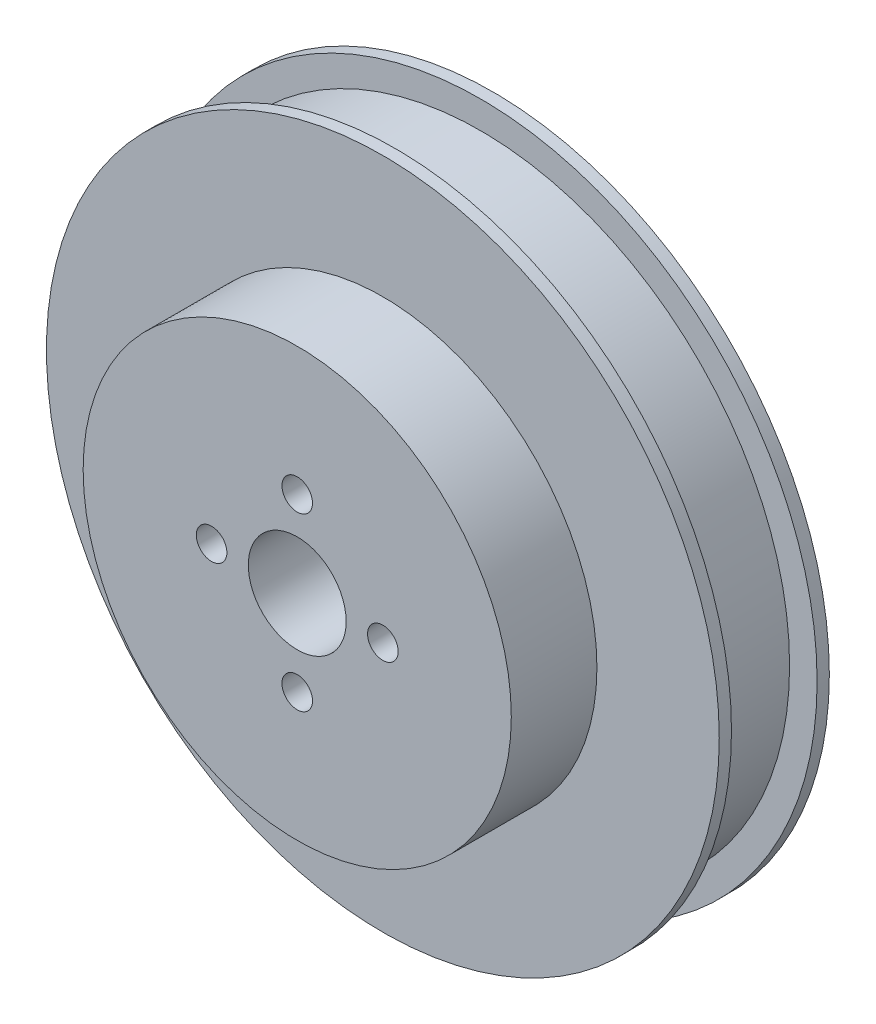
ISO-10303-21;
HEADER;
FILE_DESCRIPTION(('STEP AP214'),'2;1');
FILE_NAME('part.step','',(''),(''),'','','');
FILE_SCHEMA(('AUTOMOTIVE_DESIGN { 1 0 10303 214 1 1 1 1 }'));
ENDSEC;
DATA;
#1=APPLICATION_CONTEXT('core data for automotive mechanical design processes');
#2=APPLICATION_PROTOCOL_DEFINITION('international standard','automotive_design',2000,#1);
#3=PRODUCT_CONTEXT('',#1,'mechanical');
#4=PRODUCT('Part','Part','',(#3));
#5=PRODUCT_RELATED_PRODUCT_CATEGORY('part','',(#4));
#6=PRODUCT_DEFINITION_FORMATION('','',#4);
#7=PRODUCT_DEFINITION_CONTEXT('part definition',#1,'design');
#8=PRODUCT_DEFINITION('design','',#6,#7);
#9=PRODUCT_DEFINITION_SHAPE('','',#8);
#10=(LENGTH_UNIT() NAMED_UNIT(*) SI_UNIT(.MILLI.,.METRE.));
#11=(NAMED_UNIT(*) PLANE_ANGLE_UNIT() SI_UNIT($,.RADIAN.));
#12=(NAMED_UNIT(*) SI_UNIT($,.STERADIAN.) SOLID_ANGLE_UNIT());
#13=UNCERTAINTY_MEASURE_WITH_UNIT(LENGTH_MEASURE(1.E-05),#10,'distance_accuracy_value','');
#14=(GEOMETRIC_REPRESENTATION_CONTEXT(3) GLOBAL_UNCERTAINTY_ASSIGNED_CONTEXT((#13)) GLOBAL_UNIT_ASSIGNED_CONTEXT((#10,
#11,#12)) REPRESENTATION_CONTEXT('',''));
#15=CARTESIAN_POINT('',(0.,0.,0.));
#16=DIRECTION('',(0.,0.,1.));
#17=DIRECTION('',(1.,0.,0.));
#18=AXIS2_PLACEMENT_3D('',#15,#16,#17);
#19=CARTESIAN_POINT('',(0.,0.,1.));
#20=DIRECTION('',(0.,0.,-1.));
#21=DIRECTION('',(-1.,0.,0.));
#22=AXIS2_PLACEMENT_3D('',#19,#20,#21);
#23=CYLINDRICAL_SURFACE('',#22,27.5);
#24=CARTESIAN_POINT('',(0.,0.,1.));
#25=DIRECTION('',(0.,0.,1.));
#26=DIRECTION('',(1.,0.,0.));
#27=AXIS2_PLACEMENT_3D('',#24,#25,#26);
#28=CIRCLE('',#27,27.5);
#29=CARTESIAN_POINT('',(27.5,0.,1.));
#30=VERTEX_POINT('',#29);
#31=EDGE_CURVE('E43',#30,#30,#28,.T.);
#32=ORIENTED_EDGE('',*,*,#31,.F.);
#33=EDGE_LOOP('',(#32));
#34=FACE_BOUND('',#33,.T.);
#35=CARTESIAN_POINT('',(0.,0.,0.));
#36=DIRECTION('',(0.,0.,1.));
#37=DIRECTION('',(1.,0.,0.));
#38=AXIS2_PLACEMENT_3D('',#35,#36,#37);
#39=CIRCLE('',#38,27.5);
#40=CARTESIAN_POINT('',(27.5,0.,0.));
#41=VERTEX_POINT('',#40);
#42=EDGE_CURVE('E57',#41,#41,#39,.T.);
#43=ORIENTED_EDGE('',*,*,#42,.T.);
#44=EDGE_LOOP('',(#43));
#45=FACE_BOUND('',#44,.T.);
#46=ADVANCED_FACE('F31',(#34,#45),#23,.T.);
#47=CARTESIAN_POINT('',(0.,0.,1.));
#48=DIRECTION('',(0.,0.,1.));
#49=DIRECTION('',(1.,0.,0.));
#50=AXIS2_PLACEMENT_3D('',#47,#48,#49);
#51=PLANE('',#50);
#52=CARTESIAN_POINT('',(0.,0.,1.));
#53=DIRECTION('',(0.,0.,1.));
#54=DIRECTION('',(1.,0.,0.));
#55=AXIS2_PLACEMENT_3D('',#52,#53,#54);
#56=CIRCLE('',#55,25.25);
#57=CARTESIAN_POINT('',(25.25,0.,1.));
#58=VERTEX_POINT('',#57);
#59=EDGE_CURVE('E38',#58,#58,#56,.T.);
#60=ORIENTED_EDGE('',*,*,#59,.F.);
#61=EDGE_LOOP('',(#60));
#62=FACE_BOUND('',#61,.T.);
#63=ORIENTED_EDGE('',*,*,#31,.T.);
#64=EDGE_LOOP('',(#63));
#65=FACE_BOUND('',#64,.T.);
#66=ADVANCED_FACE('F102',(#62,#65),#51,.T.);
#67=CARTESIAN_POINT('',(0.,0.,0.));
#68=DIRECTION('',(0.,0.,1.));
#69=DIRECTION('',(1.,0.,0.));
#70=AXIS2_PLACEMENT_3D('',#67,#68,#69);
#71=PLANE('',#70);
#72=CARTESIAN_POINT('',(-7.,0.,0.));
#73=DIRECTION('',(0.,0.,-1.));
#74=DIRECTION('',(-1.,0.,0.));
#75=AXIS2_PLACEMENT_3D('',#72,#73,#74);
#76=CIRCLE('',#75,1.25);
#77=CARTESIAN_POINT('',(-8.25,0.,0.));
#78=VERTEX_POINT('',#77);
#79=EDGE_CURVE('E67',#78,#78,#76,.T.);
#80=ORIENTED_EDGE('',*,*,#79,.F.);
#81=EDGE_LOOP('',(#80));
#82=FACE_BOUND('',#81,.T.);
#83=CARTESIAN_POINT('',(0.,-7.,0.));
#84=DIRECTION('',(0.,0.,-1.));
#85=DIRECTION('',(-1.,0.,0.));
#86=AXIS2_PLACEMENT_3D('',#83,#84,#85);
#87=CIRCLE('',#86,1.25);
#88=CARTESIAN_POINT('',(-1.24999999999998,-7.,0.));
#89=VERTEX_POINT('',#88);
#90=EDGE_CURVE('E90',#89,#89,#87,.T.);
#91=ORIENTED_EDGE('',*,*,#90,.F.);
#92=EDGE_LOOP('',(#91));
#93=FACE_BOUND('',#92,.T.);
#94=CARTESIAN_POINT('',(7.,0.,0.));
#95=DIRECTION('',(0.,0.,-1.));
#96=DIRECTION('',(-1.,0.,0.));
#97=AXIS2_PLACEMENT_3D('',#94,#95,#96);
#98=CIRCLE('',#97,1.25);
#99=CARTESIAN_POINT('',(5.75,0.,0.));
#100=VERTEX_POINT('',#99);
#101=EDGE_CURVE('E87',#100,#100,#98,.T.);
#102=ORIENTED_EDGE('',*,*,#101,.F.);
#103=EDGE_LOOP('',(#102));
#104=FACE_BOUND('',#103,.T.);
#105=CARTESIAN_POINT('',(0.,7.,0.));
#106=DIRECTION('',(0.,0.,-1.));
#107=DIRECTION('',(-1.,0.,0.));
#108=AXIS2_PLACEMENT_3D('',#105,#106,#107);
#109=CIRCLE('',#108,1.25);
#110=CARTESIAN_POINT('',(-1.25000000000007,7.,0.));
#111=VERTEX_POINT('',#110);
#112=EDGE_CURVE('E84',#111,#111,#109,.T.);
#113=ORIENTED_EDGE('',*,*,#112,.F.);
#114=EDGE_LOOP('',(#113));
#115=FACE_BOUND('',#114,.T.);
#116=CARTESIAN_POINT('',(0.,0.,0.));
#117=DIRECTION('',(0.,0.,1.));
#118=DIRECTION('',(1.,0.,0.));
#119=AXIS2_PLACEMENT_3D('',#116,#117,#118);
#120=CIRCLE('',#119,4.);
#121=CARTESIAN_POINT('',(4.,0.,0.));
#122=VERTEX_POINT('',#121);
#123=EDGE_CURVE('E78',#122,#122,#120,.T.);
#124=ORIENTED_EDGE('',*,*,#123,.T.);
#125=EDGE_LOOP('',(#124));
#126=FACE_BOUND('',#125,.T.);
#127=ORIENTED_EDGE('',*,*,#42,.F.);
#128=EDGE_LOOP('',(#127));
#129=FACE_BOUND('',#128,.T.);
#130=ADVANCED_FACE('F98',(#82,#93,#104,#115,#126,#129),#71,.F.);
#131=CARTESIAN_POINT('',(0.,0.,8.));
#132=DIRECTION('',(0.,0.,-1.));
#133=DIRECTION('',(-1.,0.,0.));
#134=AXIS2_PLACEMENT_3D('',#131,#132,#133);
#135=CYLINDRICAL_SURFACE('',#134,25.25);
#136=CARTESIAN_POINT('',(0.,0.,8.));
#137=DIRECTION('',(0.,0.,1.));
#138=DIRECTION('',(1.,0.,0.));
#139=AXIS2_PLACEMENT_3D('',#136,#137,#138);
#140=CIRCLE('',#139,25.25);
#141=CARTESIAN_POINT('',(25.25,0.,8.));
#142=VERTEX_POINT('',#141);
#143=EDGE_CURVE('E52',#142,#142,#140,.T.);
#144=ORIENTED_EDGE('',*,*,#143,.F.);
#145=EDGE_LOOP('',(#144));
#146=FACE_BOUND('',#145,.T.);
#147=ORIENTED_EDGE('',*,*,#59,.T.);
#148=EDGE_LOOP('',(#147));
#149=FACE_BOUND('',#148,.T.);
#150=ADVANCED_FACE('F101',(#146,#149),#135,.T.);
#151=CARTESIAN_POINT('',(0.,0.,9.));
#152=DIRECTION('',(0.,0.,-1.));
#153=DIRECTION('',(-1.,0.,0.));
#154=AXIS2_PLACEMENT_3D('',#151,#152,#153);
#155=CYLINDRICAL_SURFACE('',#154,27.5);
#156=CARTESIAN_POINT('',(0.,0.,9.));
#157=DIRECTION('',(0.,0.,1.));
#158=DIRECTION('',(1.,0.,0.));
#159=AXIS2_PLACEMENT_3D('',#156,#157,#158);
#160=CIRCLE('',#159,27.5);
#161=CARTESIAN_POINT('',(27.5,0.,9.));
#162=VERTEX_POINT('',#161);
#163=EDGE_CURVE('E49',#162,#162,#160,.T.);
#164=ORIENTED_EDGE('',*,*,#163,.F.);
#165=EDGE_LOOP('',(#164));
#166=FACE_BOUND('',#165,.T.);
#167=CARTESIAN_POINT('',(0.,0.,8.));
#168=DIRECTION('',(0.,0.,1.));
#169=DIRECTION('',(1.,0.,0.));
#170=AXIS2_PLACEMENT_3D('',#167,#168,#169);
#171=CIRCLE('',#170,27.5);
#172=CARTESIAN_POINT('',(27.5,0.,8.));
#173=VERTEX_POINT('',#172);
#174=EDGE_CURVE('E53',#173,#173,#171,.T.);
#175=ORIENTED_EDGE('',*,*,#174,.T.);
#176=EDGE_LOOP('',(#175));
#177=FACE_BOUND('',#176,.T.);
#178=ADVANCED_FACE('F129',(#166,#177),#155,.T.);
#179=CARTESIAN_POINT('',(0.,0.,9.));
#180=DIRECTION('',(0.,0.,1.));
#181=DIRECTION('',(1.,0.,0.));
#182=AXIS2_PLACEMENT_3D('',#179,#180,#181);
#183=PLANE('',#182);
#184=CARTESIAN_POINT('',(0.,0.,9.));
#185=DIRECTION('',(0.,0.,1.));
#186=DIRECTION('',(1.,0.,0.));
#187=AXIS2_PLACEMENT_3D('',#184,#185,#186);
#188=CIRCLE('',#187,17.5);
#189=CARTESIAN_POINT('',(17.5,0.,9.));
#190=VERTEX_POINT('',#189);
#191=EDGE_CURVE('E10',#190,#190,#188,.T.);
#192=ORIENTED_EDGE('',*,*,#191,.F.);
#193=EDGE_LOOP('',(#192));
#194=FACE_BOUND('',#193,.T.);
#195=ORIENTED_EDGE('',*,*,#163,.T.);
#196=EDGE_LOOP('',(#195));
#197=FACE_BOUND('',#196,.T.);
#198=ADVANCED_FACE('F133',(#194,#197),#183,.T.);
#199=CARTESIAN_POINT('',(0.,0.,8.));
#200=DIRECTION('',(0.,0.,1.));
#201=DIRECTION('',(1.,0.,0.));
#202=AXIS2_PLACEMENT_3D('',#199,#200,#201);
#203=PLANE('',#202);
#204=ORIENTED_EDGE('',*,*,#143,.T.);
#205=EDGE_LOOP('',(#204));
#206=FACE_BOUND('',#205,.T.);
#207=ORIENTED_EDGE('',*,*,#174,.F.);
#208=EDGE_LOOP('',(#207));
#209=FACE_BOUND('',#208,.T.);
#210=ADVANCED_FACE('F135',(#206,#209),#203,.F.);
#211=CARTESIAN_POINT('',(0.,0.,16.));
#212=DIRECTION('',(0.,0.,-1.));
#213=DIRECTION('',(-1.,0.,0.));
#214=AXIS2_PLACEMENT_3D('',#211,#212,#213);
#215=CYLINDRICAL_SURFACE('',#214,17.5);
#216=CARTESIAN_POINT('',(0.,0.,16.));
#217=DIRECTION('',(0.,0.,1.));
#218=DIRECTION('',(1.,0.,0.));
#219=AXIS2_PLACEMENT_3D('',#216,#217,#218);
#220=CIRCLE('',#219,17.5);
#221=CARTESIAN_POINT('',(17.5,0.,16.));
#222=VERTEX_POINT('',#221);
#223=EDGE_CURVE('E47',#222,#222,#220,.T.);
#224=ORIENTED_EDGE('',*,*,#223,.F.);
#225=EDGE_LOOP('',(#224));
#226=FACE_BOUND('',#225,.T.);
#227=ORIENTED_EDGE('',*,*,#191,.T.);
#228=EDGE_LOOP('',(#227));
#229=FACE_BOUND('',#228,.T.);
#230=ADVANCED_FACE('F138',(#226,#229),#215,.T.);
#231=CARTESIAN_POINT('',(0.,0.,16.));
#232=DIRECTION('',(0.,0.,1.));
#233=DIRECTION('',(1.,0.,0.));
#234=AXIS2_PLACEMENT_3D('',#231,#232,#233);
#235=PLANE('',#234);
#236=CARTESIAN_POINT('',(-7.,0.,16.));
#237=DIRECTION('',(0.,0.,1.));
#238=DIRECTION('',(1.,0.,0.));
#239=AXIS2_PLACEMENT_3D('',#236,#237,#238);
#240=CIRCLE('',#239,1.25);
#241=CARTESIAN_POINT('',(-5.75,0.,16.));
#242=VERTEX_POINT('',#241);
#243=EDGE_CURVE('E34',#242,#242,#240,.T.);
#244=ORIENTED_EDGE('',*,*,#243,.F.);
#245=EDGE_LOOP('',(#244));
#246=FACE_BOUND('',#245,.T.);
#247=CARTESIAN_POINT('',(0.,-7.,16.));
#248=DIRECTION('',(0.,0.,1.));
#249=DIRECTION('',(1.,0.,0.));
#250=AXIS2_PLACEMENT_3D('',#247,#248,#249);
#251=CIRCLE('',#250,1.25);
#252=CARTESIAN_POINT('',(1.25000000000002,-7.,16.));
#253=VERTEX_POINT('',#252);
#254=EDGE_CURVE('E69',#253,#253,#251,.T.);
#255=ORIENTED_EDGE('',*,*,#254,.F.);
#256=EDGE_LOOP('',(#255));
#257=FACE_BOUND('',#256,.T.);
#258=CARTESIAN_POINT('',(7.,0.,16.));
#259=DIRECTION('',(0.,0.,1.));
#260=DIRECTION('',(1.,0.,0.));
#261=AXIS2_PLACEMENT_3D('',#258,#259,#260);
#262=CIRCLE('',#261,1.25);
#263=CARTESIAN_POINT('',(8.25,0.,16.));
#264=VERTEX_POINT('',#263);
#265=EDGE_CURVE('E66',#264,#264,#262,.T.);
#266=ORIENTED_EDGE('',*,*,#265,.F.);
#267=EDGE_LOOP('',(#266));
#268=FACE_BOUND('',#267,.T.);
#269=CARTESIAN_POINT('',(0.,7.,16.));
#270=DIRECTION('',(0.,0.,1.));
#271=DIRECTION('',(1.,0.,0.));
#272=AXIS2_PLACEMENT_3D('',#269,#270,#271);
#273=CIRCLE('',#272,1.25);
#274=CARTESIAN_POINT('',(1.24999999999993,7.,16.));
#275=VERTEX_POINT('',#274);
#276=EDGE_CURVE('E63',#275,#275,#273,.T.);
#277=ORIENTED_EDGE('',*,*,#276,.F.);
#278=EDGE_LOOP('',(#277));
#279=FACE_BOUND('',#278,.T.);
#280=CARTESIAN_POINT('',(0.,0.,16.));
#281=DIRECTION('',(0.,0.,1.));
#282=DIRECTION('',(1.,0.,0.));
#283=AXIS2_PLACEMENT_3D('',#280,#281,#282);
#284=CIRCLE('',#283,4.);
#285=CARTESIAN_POINT('',(4.,0.,16.));
#286=VERTEX_POINT('',#285);
#287=EDGE_CURVE('E74',#286,#286,#284,.T.);
#288=ORIENTED_EDGE('',*,*,#287,.F.);
#289=EDGE_LOOP('',(#288));
#290=FACE_BOUND('',#289,.T.);
#291=ORIENTED_EDGE('',*,*,#223,.T.);
#292=EDGE_LOOP('',(#291));
#293=FACE_BOUND('',#292,.T.);
#294=ADVANCED_FACE('F145',(#246,#257,#268,#279,#290,#293),#235,.T.);
#295=CARTESIAN_POINT('',(0.,0.,-84.));
#296=DIRECTION('',(0.,0.,1.));
#297=DIRECTION('',(1.,0.,0.));
#298=AXIS2_PLACEMENT_3D('',#295,#296,#297);
#299=CYLINDRICAL_SURFACE('',#298,4.);
#300=ORIENTED_EDGE('',*,*,#287,.T.);
#301=EDGE_LOOP('',(#300));
#302=FACE_BOUND('',#301,.T.);
#303=ORIENTED_EDGE('',*,*,#123,.F.);
#304=EDGE_LOOP('',(#303));
#305=FACE_BOUND('',#304,.T.);
#306=ADVANCED_FACE('F149',(#302,#305),#299,.F.);
#307=CARTESIAN_POINT('',(0.,7.,100.));
#308=DIRECTION('',(0.,0.,-1.));
#309=DIRECTION('',(-1.,0.,0.));
#310=AXIS2_PLACEMENT_3D('',#307,#308,#309);
#311=CYLINDRICAL_SURFACE('',#310,1.25);
#312=ORIENTED_EDGE('',*,*,#276,.T.);
#313=EDGE_LOOP('',(#312));
#314=FACE_BOUND('',#313,.T.);
#315=ORIENTED_EDGE('',*,*,#112,.T.);
#316=EDGE_LOOP('',(#315));
#317=FACE_BOUND('',#316,.T.);
#318=ADVANCED_FACE('F153',(#314,#317),#311,.F.);
#319=CARTESIAN_POINT('',(7.,0.,100.));
#320=DIRECTION('',(0.,0.,-1.));
#321=DIRECTION('',(-1.,0.,0.));
#322=AXIS2_PLACEMENT_3D('',#319,#320,#321);
#323=CYLINDRICAL_SURFACE('',#322,1.25);
#324=ORIENTED_EDGE('',*,*,#265,.T.);
#325=EDGE_LOOP('',(#324));
#326=FACE_BOUND('',#325,.T.);
#327=ORIENTED_EDGE('',*,*,#101,.T.);
#328=EDGE_LOOP('',(#327));
#329=FACE_BOUND('',#328,.T.);
#330=ADVANCED_FACE('F156',(#326,#329),#323,.F.);
#331=CARTESIAN_POINT('',(0.,-7.,100.));
#332=DIRECTION('',(0.,0.,-1.));
#333=DIRECTION('',(-1.,0.,0.));
#334=AXIS2_PLACEMENT_3D('',#331,#332,#333);
#335=CYLINDRICAL_SURFACE('',#334,1.25);
#336=ORIENTED_EDGE('',*,*,#254,.T.);
#337=EDGE_LOOP('',(#336));
#338=FACE_BOUND('',#337,.T.);
#339=ORIENTED_EDGE('',*,*,#90,.T.);
#340=EDGE_LOOP('',(#339));
#341=FACE_BOUND('',#340,.T.);
#342=ADVANCED_FACE('F160',(#338,#341),#335,.F.);
#343=CARTESIAN_POINT('',(-7.,0.,100.));
#344=DIRECTION('',(0.,0.,-1.));
#345=DIRECTION('',(-1.,0.,0.));
#346=AXIS2_PLACEMENT_3D('',#343,#344,#345);
#347=CYLINDRICAL_SURFACE('',#346,1.25);
#348=ORIENTED_EDGE('',*,*,#243,.T.);
#349=EDGE_LOOP('',(#348));
#350=FACE_BOUND('',#349,.T.);
#351=ORIENTED_EDGE('',*,*,#79,.T.);
#352=EDGE_LOOP('',(#351));
#353=FACE_BOUND('',#352,.T.);
#354=ADVANCED_FACE('F96',(#350,#353),#347,.F.);
#355=CLOSED_SHELL('',(#46,#66,#130,#150,#178,#198,#210,#230,#294,#306,#318,#330,#342,#354));
#356=MANIFOLD_SOLID_BREP('B2',#355);
#357=ADVANCED_BREP_SHAPE_REPRESENTATION('',(#18,#356),#14);
#358=SHAPE_DEFINITION_REPRESENTATION(#9,#357);
ENDSEC;
END-ISO-10303-21;
